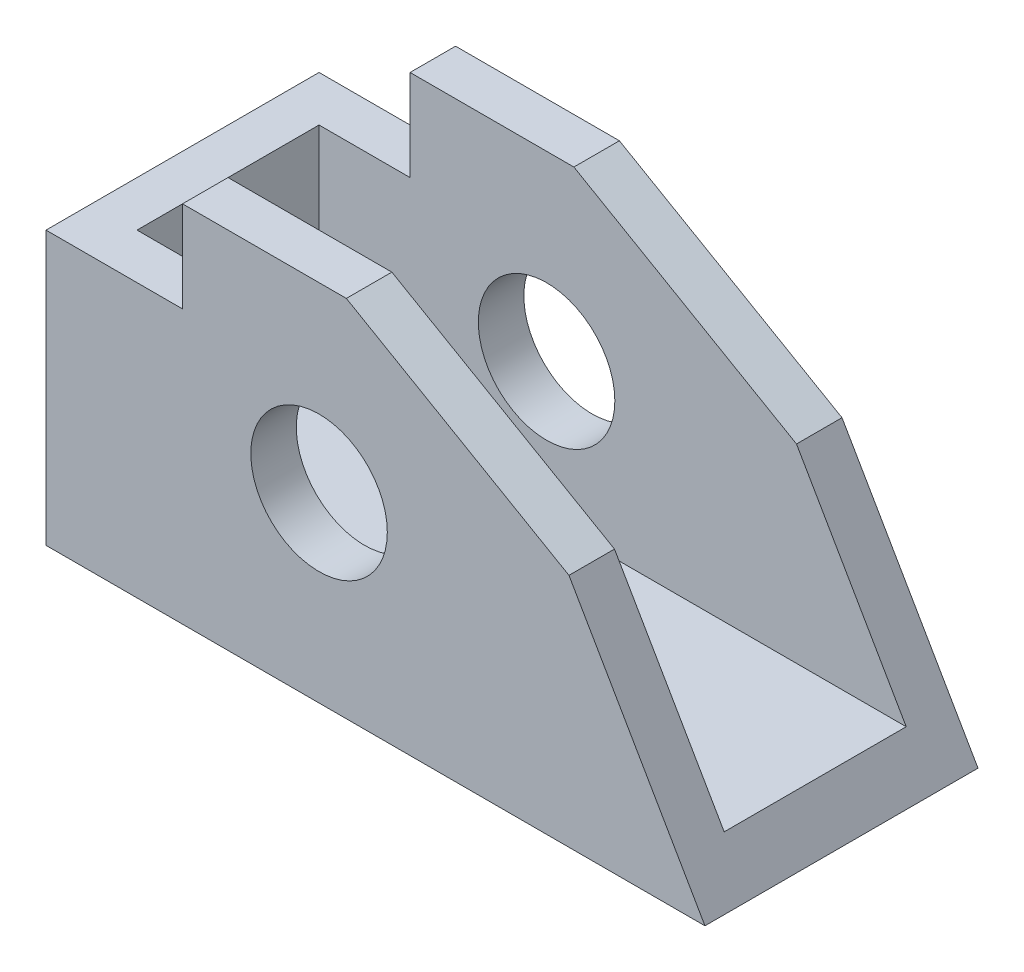
ISO-10303-21;
HEADER;
FILE_DESCRIPTION(('STEP AP214'),'2;1');
FILE_NAME('part.step','',(''),(''),'','','');
FILE_SCHEMA(('AUTOMOTIVE_DESIGN { 1 0 10303 214 1 1 1 1 }'));
ENDSEC;
DATA;
#1=APPLICATION_CONTEXT('core data for automotive mechanical design processes');
#2=APPLICATION_PROTOCOL_DEFINITION('international standard','automotive_design',2000,#1);
#3=PRODUCT_CONTEXT('',#1,'mechanical');
#4=PRODUCT('Part','Part','',(#3));
#5=PRODUCT_RELATED_PRODUCT_CATEGORY('part','',(#4));
#6=PRODUCT_DEFINITION_FORMATION('','',#4);
#7=PRODUCT_DEFINITION_CONTEXT('part definition',#1,'design');
#8=PRODUCT_DEFINITION('design','',#6,#7);
#9=PRODUCT_DEFINITION_SHAPE('','',#8);
#10=(LENGTH_UNIT() NAMED_UNIT(*) SI_UNIT(.MILLI.,.METRE.));
#11=(NAMED_UNIT(*) PLANE_ANGLE_UNIT() SI_UNIT($,.RADIAN.));
#12=(NAMED_UNIT(*) SI_UNIT($,.STERADIAN.) SOLID_ANGLE_UNIT());
#13=UNCERTAINTY_MEASURE_WITH_UNIT(LENGTH_MEASURE(1.E-05),#10,'distance_accuracy_value','');
#14=(GEOMETRIC_REPRESENTATION_CONTEXT(3) GLOBAL_UNCERTAINTY_ASSIGNED_CONTEXT((#13)) GLOBAL_UNIT_ASSIGNED_CONTEXT((#10,
#11,#12)) REPRESENTATION_CONTEXT('',''));
#15=CARTESIAN_POINT('',(0.,0.,0.));
#16=DIRECTION('',(0.,0.,1.));
#17=DIRECTION('',(1.,0.,0.));
#18=AXIS2_PLACEMENT_3D('',#15,#16,#17);
#19=CARTESIAN_POINT('',(0.,50.8,0.));
#20=DIRECTION('',(0.,1.,0.));
#21=DIRECTION('',(0.,0.,1.));
#22=AXIS2_PLACEMENT_3D('',#19,#20,#21);
#23=PLANE('',#22);
#24=DIRECTION('',(1.,0.,0.));
#25=VECTOR('',#24,1.);
#26=CARTESIAN_POINT('',(-96.8612519083969,50.8,-9.51175063613229));
#27=LINE('',#26,#25);
#28=CARTESIAN_POINT('',(-77.8112519083969,50.8,-9.51175063613229));
#29=VERTEX_POINT('',#28);
#30=CARTESIAN_POINT('',(-54.9512519083969,50.8,-9.51175063613229));
#31=VERTEX_POINT('',#30);
#32=EDGE_CURVE('E264',#29,#31,#27,.T.);
#33=ORIENTED_EDGE('',*,*,#32,.T.);
#34=DIRECTION('',(0.,0.,1.));
#35=VECTOR('',#34,1.);
#36=CARTESIAN_POINT('',(-54.9512519083969,50.8,-47.6117506361323));
#37=LINE('',#36,#35);
#38=CARTESIAN_POINT('',(-54.9512519083969,50.8,-15.8617506361323));
#39=VERTEX_POINT('',#38);
#40=EDGE_CURVE('E161',#39,#31,#37,.T.);
#41=ORIENTED_EDGE('',*,*,#40,.F.);
#42=DIRECTION('',(-1.,0.,0.));
#43=VECTOR('',#42,1.);
#44=CARTESIAN_POINT('',(0.,50.8,-15.8617506361323));
#45=LINE('',#44,#43);
#46=CARTESIAN_POINT('',(-77.8112519083969,50.8,-15.8617506361323));
#47=VERTEX_POINT('',#46);
#48=EDGE_CURVE('E194',#39,#47,#45,.T.);
#49=ORIENTED_EDGE('',*,*,#48,.T.);
#50=DIRECTION('',(0.,0.,1.));
#51=VECTOR('',#50,1.);
#52=CARTESIAN_POINT('',(-77.8112519083969,50.8,-47.6117506361323));
#53=LINE('',#52,#51);
#54=EDGE_CURVE('E248',#47,#29,#53,.T.);
#55=ORIENTED_EDGE('',*,*,#54,.T.);
#56=EDGE_LOOP('',(#33,#41,#49,#55));
#57=FACE_BOUND('',#56,.T.);
#58=ADVANCED_FACE('F39',(#57),#23,.T.);
#59=CARTESIAN_POINT('',(-96.8612519083969,50.8,-9.51175063613229));
#60=DIRECTION('',(0.,0.,-1.));
#61=DIRECTION('',(-1.,0.,0.));
#62=AXIS2_PLACEMENT_3D('',#59,#60,#61);
#63=PLANE('',#62);
#64=CARTESIAN_POINT('',(-58.7612519083969,25.4,-9.51175063613229));
#65=DIRECTION('',(0.,0.,1.));
#66=DIRECTION('',(1.,0.,0.));
#67=AXIS2_PLACEMENT_3D('',#64,#65,#66);
#68=CIRCLE('',#67,9.525);
#69=CARTESIAN_POINT('',(-49.2362519083969,25.4,-9.51175063613229));
#70=VERTEX_POINT('',#69);
#71=EDGE_CURVE('E247',#70,#70,#68,.T.);
#72=ORIENTED_EDGE('',*,*,#71,.F.);
#73=EDGE_LOOP('',(#72));
#74=FACE_BOUND('',#73,.T.);
#75=DIRECTION('',(-0.866025403784442,0.499999999999995,0.));
#76=VECTOR('',#75,1.);
#77=CARTESIAN_POINT('',(8.25923227902564,14.3054099387855,-9.51175063613229));
#78=LINE('',#77,#76);
#79=CARTESIAN_POINT('',(-23.8883424206465,32.8658208454345,-9.51175063613229));
#80=VERTEX_POINT('',#79);
#81=EDGE_CURVE('E172',#80,#31,#78,.T.);
#82=ORIENTED_EDGE('',*,*,#81,.T.);
#83=ORIENTED_EDGE('',*,*,#32,.F.);
#84=DIRECTION('',(0.,1.,0.));
#85=VECTOR('',#84,1.);
#86=CARTESIAN_POINT('',(-77.8112519083969,38.1,-9.51175063613229));
#87=LINE('',#86,#85);
#88=CARTESIAN_POINT('',(-77.8112519083969,38.1,-9.51175063613229));
#89=VERTEX_POINT('',#88);
#90=EDGE_CURVE('E233',#89,#29,#87,.T.);
#91=ORIENTED_EDGE('',*,*,#90,.F.);
#92=DIRECTION('',(1.,0.,0.));
#93=VECTOR('',#92,1.);
#94=CARTESIAN_POINT('',(-96.8612519083969,38.1,-9.51175063613229));
#95=LINE('',#94,#93);
#96=CARTESIAN_POINT('',(-96.8612519083969,38.1,-9.51175063613229));
#97=VERTEX_POINT('',#96);
#98=EDGE_CURVE('E227',#97,#89,#95,.T.);
#99=ORIENTED_EDGE('',*,*,#98,.F.);
#100=DIRECTION('',(0.,-1.,0.));
#101=VECTOR('',#100,1.);
#102=CARTESIAN_POINT('',(-96.8612519083969,50.8,-9.51175063613229));
#103=LINE('',#102,#101);
#104=CARTESIAN_POINT('',(-96.8612519083969,0.,-9.51175063613229));
#105=VERTEX_POINT('',#104);
#106=EDGE_CURVE('E285',#97,#105,#103,.T.);
#107=ORIENTED_EDGE('',*,*,#106,.T.);
#108=DIRECTION('',(1.,0.,0.));
#109=VECTOR('',#108,1.);
#110=CARTESIAN_POINT('',(-96.8612519083969,0.,-9.51175063613229));
#111=LINE('',#110,#109);
#112=CARTESIAN_POINT('',(-4.91325190839691,0.,-9.51175063613229));
#113=VERTEX_POINT('',#112);
#114=EDGE_CURVE('E275',#105,#113,#111,.T.);
#115=ORIENTED_EDGE('',*,*,#114,.T.);
#116=DIRECTION('',(-0.499999999999998,0.86602540378444,0.));
#117=VECTOR('',#116,1.);
#118=CARTESIAN_POINT('',(-3.6849389312977,-2.12750048393205,-9.51175063613229));
#119=LINE('',#118,#117);
#120=EDGE_CURVE('E168',#113,#80,#119,.T.);
#121=ORIENTED_EDGE('',*,*,#120,.T.);
#122=EDGE_LOOP('',(#82,#83,#91,#99,#107,#115,#121));
#123=FACE_BOUND('',#122,.T.);
#124=ADVANCED_FACE('F329',(#74,#123),#63,.F.);
#125=CARTESIAN_POINT('',(-96.8612519083969,50.8,-47.6117506361323));
#126=DIRECTION('',(0.,0.,1.));
#127=DIRECTION('',(1.,0.,0.));
#128=AXIS2_PLACEMENT_3D('',#125,#126,#127);
#129=PLANE('',#128);
#130=CARTESIAN_POINT('',(-58.7612519083969,25.4,-47.6117506361323));
#131=DIRECTION('',(0.,0.,1.));
#132=DIRECTION('',(1.,0.,0.));
#133=AXIS2_PLACEMENT_3D('',#130,#131,#132);
#134=CIRCLE('',#133,9.525);
#135=CARTESIAN_POINT('',(-49.2362519083969,25.4,-47.6117506361323));
#136=VERTEX_POINT('',#135);
#137=EDGE_CURVE('E256',#136,#136,#134,.T.);
#138=ORIENTED_EDGE('',*,*,#137,.T.);
#139=EDGE_LOOP('',(#138));
#140=FACE_BOUND('',#139,.T.);
#141=DIRECTION('',(-0.866025403784442,0.499999999999995,0.));
#142=VECTOR('',#141,1.);
#143=CARTESIAN_POINT('',(8.25923227902564,14.3054099387855,-47.6117506361323));
#144=LINE('',#143,#142);
#145=CARTESIAN_POINT('',(-23.8883424206465,32.8658208454345,-47.6117506361323));
#146=VERTEX_POINT('',#145);
#147=CARTESIAN_POINT('',(-54.9512519083969,50.8,-47.6117506361323));
#148=VERTEX_POINT('',#147);
#149=EDGE_CURVE('E153',#146,#148,#144,.T.);
#150=ORIENTED_EDGE('',*,*,#149,.F.);
#151=DIRECTION('',(-0.499999999999998,0.86602540378444,0.));
#152=VECTOR('',#151,1.);
#153=CARTESIAN_POINT('',(-3.6849389312977,-2.12750048393205,-47.6117506361323));
#154=LINE('',#153,#152);
#155=CARTESIAN_POINT('',(-4.91325190839691,0.,-47.6117506361323));
#156=VERTEX_POINT('',#155);
#157=EDGE_CURVE('E141',#156,#146,#154,.T.);
#158=ORIENTED_EDGE('',*,*,#157,.F.);
#159=DIRECTION('',(-1.,0.,0.));
#160=VECTOR('',#159,1.);
#161=CARTESIAN_POINT('',(-96.8612519083969,0.,-47.6117506361323));
#162=LINE('',#161,#160);
#163=CARTESIAN_POINT('',(-96.8612519083969,0.,-47.6117506361323));
#164=VERTEX_POINT('',#163);
#165=EDGE_CURVE('E268',#156,#164,#162,.T.);
#166=ORIENTED_EDGE('',*,*,#165,.T.);
#167=DIRECTION('',(0.,-1.,0.));
#168=VECTOR('',#167,1.);
#169=CARTESIAN_POINT('',(-96.8612519083969,50.8,-47.6117506361323));
#170=LINE('',#169,#168);
#171=CARTESIAN_POINT('',(-96.8612519083969,38.1,-47.6117506361323));
#172=VERTEX_POINT('',#171);
#173=EDGE_CURVE('E271',#172,#164,#170,.T.);
#174=ORIENTED_EDGE('',*,*,#173,.F.);
#175=DIRECTION('',(1.,0.,0.));
#176=VECTOR('',#175,1.);
#177=CARTESIAN_POINT('',(-96.8612519083969,38.1,-47.6117506361323));
#178=LINE('',#177,#176);
#179=CARTESIAN_POINT('',(-77.8112519083969,38.1,-47.6117506361323));
#180=VERTEX_POINT('',#179);
#181=EDGE_CURVE('E228',#172,#180,#178,.T.);
#182=ORIENTED_EDGE('',*,*,#181,.T.);
#183=DIRECTION('',(0.,1.,0.));
#184=VECTOR('',#183,1.);
#185=CARTESIAN_POINT('',(-77.8112519083969,38.1,-47.6117506361323));
#186=LINE('',#185,#184);
#187=CARTESIAN_POINT('',(-77.8112519083969,50.8,-47.6117506361323));
#188=VERTEX_POINT('',#187);
#189=EDGE_CURVE('E232',#180,#188,#186,.T.);
#190=ORIENTED_EDGE('',*,*,#189,.T.);
#191=DIRECTION('',(-1.,0.,0.));
#192=VECTOR('',#191,1.);
#193=CARTESIAN_POINT('',(-96.8612519083969,50.8,-47.6117506361323));
#194=LINE('',#193,#192);
#195=EDGE_CURVE('E166',#148,#188,#194,.T.);
#196=ORIENTED_EDGE('',*,*,#195,.F.);
#197=EDGE_LOOP('',(#150,#158,#166,#174,#182,#190,#196));
#198=FACE_BOUND('',#197,.T.);
#199=ADVANCED_FACE('F164',(#140,#198),#129,.F.);
#200=DIRECTION('',(-1.,0.,0.));
#201=VECTOR('',#200,1.);
#202=CARTESIAN_POINT('',(0.,50.8,-41.2617506361323));
#203=LINE('',#202,#201);
#204=CARTESIAN_POINT('',(-54.9512519083969,50.8,-41.2617506361323));
#205=VERTEX_POINT('',#204);
#206=CARTESIAN_POINT('',(-77.8112519083969,50.8,-41.2617506361323));
#207=VERTEX_POINT('',#206);
#208=EDGE_CURVE('E189',#205,#207,#203,.T.);
#209=ORIENTED_EDGE('',*,*,#208,.F.);
#210=EDGE_CURVE('E178',#148,#205,#37,.T.);
#211=ORIENTED_EDGE('',*,*,#210,.F.);
#212=ORIENTED_EDGE('',*,*,#195,.T.);
#213=EDGE_CURVE('E243',#188,#207,#53,.T.);
#214=ORIENTED_EDGE('',*,*,#213,.T.);
#215=EDGE_LOOP('',(#209,#211,#212,#214));
#216=FACE_BOUND('',#215,.T.);
#217=ADVANCED_FACE('F343',(#216),#23,.T.);
#218=CARTESIAN_POINT('',(0.,6.35,-41.2617506361323));
#219=DIRECTION('',(0.,0.,-1.));
#220=DIRECTION('',(-1.,0.,0.));
#221=AXIS2_PLACEMENT_3D('',#218,#219,#220);
#222=PLANE('',#221);
#223=CARTESIAN_POINT('',(-58.7612519083969,25.4,-41.2617506361323));
#224=DIRECTION('',(0.,0.,-1.));
#225=DIRECTION('',(-1.,0.,0.));
#226=AXIS2_PLACEMENT_3D('',#223,#224,#225);
#227=CIRCLE('',#226,9.525);
#228=CARTESIAN_POINT('',(-49.2362519083969,25.4,-41.2617506361323));
#229=VERTEX_POINT('',#228);
#230=EDGE_CURVE('E223',#229,#229,#227,.F.);
#231=ORIENTED_EDGE('',*,*,#230,.F.);
#232=EDGE_LOOP('',(#231));
#233=FACE_BOUND('',#232,.T.);
#234=DIRECTION('',(0.866025403784442,-0.499999999999995,0.));
#235=VECTOR('',#234,1.);
#236=CARTESIAN_POINT('',(5.50960162201007,15.8929099387855,-41.2617506361323));
#237=LINE('',#236,#235);
#238=CARTESIAN_POINT('',(-23.8883424206465,32.8658208454345,-41.2617506361323));
#239=VERTEX_POINT('',#238);
#240=EDGE_CURVE('E159',#205,#239,#237,.T.);
#241=ORIENTED_EDGE('',*,*,#240,.F.);
#242=ORIENTED_EDGE('',*,*,#208,.T.);
#243=DIRECTION('',(0.,1.,0.));
#244=VECTOR('',#243,1.);
#245=CARTESIAN_POINT('',(-77.8112519083969,38.1,-41.2617506361323));
#246=LINE('',#245,#244);
#247=CARTESIAN_POINT('',(-77.8112519083969,38.1,-41.2617506361323));
#248=VERTEX_POINT('',#247);
#249=EDGE_CURVE('E219',#248,#207,#246,.T.);
#250=ORIENTED_EDGE('',*,*,#249,.F.);
#251=DIRECTION('',(1.,0.,0.));
#252=VECTOR('',#251,1.);
#253=CARTESIAN_POINT('',(-96.8612519083969,38.1,-41.2617506361323));
#254=LINE('',#253,#252);
#255=CARTESIAN_POINT('',(-90.5112519083969,38.1,-41.2617506361323));
#256=VERTEX_POINT('',#255);
#257=EDGE_CURVE('E295',#256,#248,#254,.T.);
#258=ORIENTED_EDGE('',*,*,#257,.F.);
#259=DIRECTION('',(0.,1.,0.));
#260=VECTOR('',#259,1.);
#261=CARTESIAN_POINT('',(-90.5112519083969,6.35,-41.2617506361323));
#262=LINE('',#261,#260);
#263=CARTESIAN_POINT('',(-90.5112519083969,6.35,-41.2617506361323));
#264=VERTEX_POINT('',#263);
#265=EDGE_CURVE('E63',#264,#256,#262,.T.);
#266=ORIENTED_EDGE('',*,*,#265,.F.);
#267=DIRECTION('',(-1.,0.,0.));
#268=VECTOR('',#267,1.);
#269=CARTESIAN_POINT('',(0.,6.35,-41.2617506361323));
#270=LINE('',#269,#268);
#271=CARTESIAN_POINT('',(-8.57942611775102,6.35,-41.2617506361323));
#272=VERTEX_POINT('',#271);
#273=EDGE_CURVE('E190',#272,#264,#270,.T.);
#274=ORIENTED_EDGE('',*,*,#273,.F.);
#275=DIRECTION('',(0.499999999999998,-0.86602540378444,0.));
#276=VECTOR('',#275,1.);
#277=CARTESIAN_POINT('',(-6.43456958831328,2.63499951606797,-41.2617506361323));
#278=LINE('',#277,#276);
#279=EDGE_CURVE('E55',#239,#272,#278,.T.);
#280=ORIENTED_EDGE('',*,*,#279,.F.);
#281=EDGE_LOOP('',(#241,#242,#250,#258,#266,#274,#280));
#282=FACE_BOUND('',#281,.T.);
#283=ADVANCED_FACE('F304',(#233,#282),#222,.F.);
#284=CARTESIAN_POINT('',(0.,6.35,-15.8617506361323));
#285=DIRECTION('',(0.,0.,-1.));
#286=DIRECTION('',(-1.,0.,0.));
#287=AXIS2_PLACEMENT_3D('',#284,#285,#286);
#288=PLANE('',#287);
#289=CARTESIAN_POINT('',(-58.7612519083969,25.4,-15.8617506361323));
#290=DIRECTION('',(0.,0.,-1.));
#291=DIRECTION('',(-1.,0.,0.));
#292=AXIS2_PLACEMENT_3D('',#289,#290,#291);
#293=CIRCLE('',#292,9.525);
#294=CARTESIAN_POINT('',(-49.2362519083969,25.4,-15.8617506361323));
#295=VERTEX_POINT('',#294);
#296=EDGE_CURVE('E215',#295,#295,#293,.F.);
#297=ORIENTED_EDGE('',*,*,#296,.T.);
#298=EDGE_LOOP('',(#297));
#299=FACE_BOUND('',#298,.T.);
#300=ORIENTED_EDGE('',*,*,#48,.F.);
#301=DIRECTION('',(0.866025403784442,-0.499999999999995,0.));
#302=VECTOR('',#301,1.);
#303=CARTESIAN_POINT('',(5.50960162201007,15.8929099387855,-15.8617506361323));
#304=LINE('',#303,#302);
#305=CARTESIAN_POINT('',(-23.8883424206465,32.8658208454345,-15.8617506361323));
#306=VERTEX_POINT('',#305);
#307=EDGE_CURVE('E11',#39,#306,#304,.T.);
#308=ORIENTED_EDGE('',*,*,#307,.T.);
#309=DIRECTION('',(0.499999999999998,-0.86602540378444,0.));
#310=VECTOR('',#309,1.);
#311=CARTESIAN_POINT('',(-6.43456958831328,2.63499951606797,-15.8617506361323));
#312=LINE('',#311,#310);
#313=CARTESIAN_POINT('',(-8.57942611775102,6.35,-15.8617506361323));
#314=VERTEX_POINT('',#313);
#315=EDGE_CURVE('E180',#306,#314,#312,.T.);
#316=ORIENTED_EDGE('',*,*,#315,.T.);
#317=DIRECTION('',(-1.,0.,0.));
#318=VECTOR('',#317,1.);
#319=CARTESIAN_POINT('',(0.,6.35,-15.8617506361323));
#320=LINE('',#319,#318);
#321=CARTESIAN_POINT('',(-90.5112519083969,6.35,-15.8617506361323));
#322=VERTEX_POINT('',#321);
#323=EDGE_CURVE('E198',#314,#322,#320,.T.);
#324=ORIENTED_EDGE('',*,*,#323,.T.);
#325=DIRECTION('',(0.,1.,0.));
#326=VECTOR('',#325,1.);
#327=CARTESIAN_POINT('',(-90.5112519083969,6.35,-15.8617506361323));
#328=LINE('',#327,#326);
#329=CARTESIAN_POINT('',(-90.5112519083969,38.1,-15.8617506361323));
#330=VERTEX_POINT('',#329);
#331=EDGE_CURVE('E205',#322,#330,#328,.T.);
#332=ORIENTED_EDGE('',*,*,#331,.T.);
#333=DIRECTION('',(1.,0.,0.));
#334=VECTOR('',#333,1.);
#335=CARTESIAN_POINT('',(-96.8612519083969,38.1,-15.8617506361323));
#336=LINE('',#335,#334);
#337=CARTESIAN_POINT('',(-77.8112519083969,38.1,-15.8617506361323));
#338=VERTEX_POINT('',#337);
#339=EDGE_CURVE('E292',#330,#338,#336,.T.);
#340=ORIENTED_EDGE('',*,*,#339,.T.);
#341=DIRECTION('',(0.,1.,0.));
#342=VECTOR('',#341,1.);
#343=CARTESIAN_POINT('',(-77.8112519083969,38.1,-15.8617506361323));
#344=LINE('',#343,#342);
#345=EDGE_CURVE('E209',#338,#47,#344,.T.);
#346=ORIENTED_EDGE('',*,*,#345,.T.);
#347=EDGE_LOOP('',(#300,#308,#316,#324,#332,#340,#346));
#348=FACE_BOUND('',#347,.T.);
#349=ADVANCED_FACE('F310',(#299,#348),#288,.T.);
#350=CARTESIAN_POINT('',(0.,6.35,0.));
#351=DIRECTION('',(0.,1.,0.));
#352=DIRECTION('',(0.,0.,1.));
#353=AXIS2_PLACEMENT_3D('',#350,#351,#352);
#354=PLANE('',#353);
#355=ORIENTED_EDGE('',*,*,#323,.F.);
#356=DIRECTION('',(0.,0.,-1.));
#357=VECTOR('',#356,1.);
#358=CARTESIAN_POINT('',(-8.57942611775102,6.35,0.));
#359=LINE('',#358,#357);
#360=EDGE_CURVE('E48',#314,#272,#359,.T.);
#361=ORIENTED_EDGE('',*,*,#360,.T.);
#362=ORIENTED_EDGE('',*,*,#273,.T.);
#363=DIRECTION('',(0.,0.,1.));
#364=VECTOR('',#363,1.);
#365=CARTESIAN_POINT('',(-90.5112519083969,6.35,0.));
#366=LINE('',#365,#364);
#367=EDGE_CURVE('E193',#264,#322,#366,.T.);
#368=ORIENTED_EDGE('',*,*,#367,.T.);
#369=EDGE_LOOP('',(#355,#361,#362,#368));
#370=FACE_BOUND('',#369,.T.);
#371=ADVANCED_FACE('F302',(#370),#354,.T.);
#372=CARTESIAN_POINT('',(-58.7612519083969,25.4,-47.6117506361323));
#373=DIRECTION('',(0.,0.,1.));
#374=DIRECTION('',(1.,0.,0.));
#375=AXIS2_PLACEMENT_3D('',#372,#373,#374);
#376=CYLINDRICAL_SURFACE('',#375,9.525);
#377=CARTESIAN_POINT('',(-49.2362519083969,25.4,-9.51175063613229));
#378=CARTESIAN_POINT('',(-49.2362519083969,25.4,-9.57789646946563));
#379=CARTESIAN_POINT('',(-49.2362519083969,25.4,-9.64404230279896));
#380=CARTESIAN_POINT('',(-49.2362519083969,25.4,-9.77633396946563));
#381=CARTESIAN_POINT('',(-49.2362519083969,25.4,-9.84247980279896));
#382=CARTESIAN_POINT('',(-49.2362519083969,25.4,-9.97477146946562));
#383=CARTESIAN_POINT('',(-49.2362519083969,25.4,-10.040917302799));
#384=CARTESIAN_POINT('',(-49.2362519083969,25.4,-10.1732089694656));
#385=CARTESIAN_POINT('',(-49.2362519083969,25.4,-10.239354802799));
#386=CARTESIAN_POINT('',(-49.2362519083969,25.4,-10.3716464694656));
#387=CARTESIAN_POINT('',(-49.2362519083969,25.4,-10.437792302799));
#388=CARTESIAN_POINT('',(-49.2362519083969,25.4,-10.5700839694656));
#389=CARTESIAN_POINT('',(-49.2362519083969,25.4,-10.636229802799));
#390=CARTESIAN_POINT('',(-49.2362519083969,25.4,-10.7685214694656));
#391=CARTESIAN_POINT('',(-49.2362519083969,25.4,-10.834667302799));
#392=CARTESIAN_POINT('',(-49.2362519083969,25.4,-10.9669589694656));
#393=CARTESIAN_POINT('',(-49.2362519083969,25.4,-11.033104802799));
#394=CARTESIAN_POINT('',(-49.2362519083969,25.4,-11.1653964694656));
#395=CARTESIAN_POINT('',(-49.2362519083969,25.4,-11.231542302799));
#396=CARTESIAN_POINT('',(-49.2362519083969,25.4,-11.3638339694656));
#397=CARTESIAN_POINT('',(-49.2362519083969,25.4,-11.429979802799));
#398=CARTESIAN_POINT('',(-49.2362519083969,25.4,-11.5622714694656));
#399=CARTESIAN_POINT('',(-49.2362519083969,25.4,-11.628417302799));
#400=CARTESIAN_POINT('',(-49.2362519083969,25.4,-11.7607089694656));
#401=CARTESIAN_POINT('',(-49.2362519083969,25.4,-11.826854802799));
#402=CARTESIAN_POINT('',(-49.2362519083969,25.4,-11.9591464694656));
#403=CARTESIAN_POINT('',(-49.2362519083969,25.4,-12.025292302799));
#404=CARTESIAN_POINT('',(-49.2362519083969,25.4,-12.1575839694656));
#405=CARTESIAN_POINT('',(-49.2362519083969,25.4,-12.223729802799));
#406=CARTESIAN_POINT('',(-49.2362519083969,25.4,-12.3560214694656));
#407=CARTESIAN_POINT('',(-49.2362519083969,25.4,-12.422167302799));
#408=CARTESIAN_POINT('',(-49.2362519083969,25.4,-12.5544589694656));
#409=CARTESIAN_POINT('',(-49.2362519083969,25.4,-12.620604802799));
#410=CARTESIAN_POINT('',(-49.2362519083969,25.4,-12.7528964694656));
#411=CARTESIAN_POINT('',(-49.2362519083969,25.4,-12.819042302799));
#412=CARTESIAN_POINT('',(-49.2362519083969,25.4,-12.9513339694656));
#413=CARTESIAN_POINT('',(-49.2362519083969,25.4,-13.017479802799));
#414=CARTESIAN_POINT('',(-49.2362519083969,25.4,-13.1497714694656));
#415=CARTESIAN_POINT('',(-49.2362519083969,25.4,-13.215917302799));
#416=CARTESIAN_POINT('',(-49.2362519083969,25.4,-13.3482089694656));
#417=CARTESIAN_POINT('',(-49.2362519083969,25.4,-13.414354802799));
#418=CARTESIAN_POINT('',(-49.2362519083969,25.4,-13.5466464694656));
#419=CARTESIAN_POINT('',(-49.2362519083969,25.4,-13.612792302799));
#420=CARTESIAN_POINT('',(-49.2362519083969,25.4,-13.7450839694656));
#421=CARTESIAN_POINT('',(-49.2362519083969,25.4,-13.811229802799));
#422=CARTESIAN_POINT('',(-49.2362519083969,25.4,-13.9435214694656));
#423=CARTESIAN_POINT('',(-49.2362519083969,25.4,-14.009667302799));
#424=CARTESIAN_POINT('',(-49.2362519083969,25.4,-14.1419589694656));
#425=CARTESIAN_POINT('',(-49.2362519083969,25.4,-14.208104802799));
#426=CARTESIAN_POINT('',(-49.2362519083969,25.4,-14.3403964694656));
#427=CARTESIAN_POINT('',(-49.2362519083969,25.4,-14.406542302799));
#428=CARTESIAN_POINT('',(-49.2362519083969,25.4,-14.5388339694656));
#429=CARTESIAN_POINT('',(-49.2362519083969,25.4,-14.604979802799));
#430=CARTESIAN_POINT('',(-49.2362519083969,25.4,-14.7372714694656));
#431=CARTESIAN_POINT('',(-49.2362519083969,25.4,-14.803417302799));
#432=CARTESIAN_POINT('',(-49.2362519083969,25.4,-14.9357089694656));
#433=CARTESIAN_POINT('',(-49.2362519083969,25.4,-15.001854802799));
#434=CARTESIAN_POINT('',(-49.2362519083969,25.4,-15.1341464694656));
#435=CARTESIAN_POINT('',(-49.2362519083969,25.4,-15.200292302799));
#436=CARTESIAN_POINT('',(-49.2362519083969,25.4,-15.3325839694656));
#437=CARTESIAN_POINT('',(-49.2362519083969,25.4,-15.398729802799));
#438=CARTESIAN_POINT('',(-49.2362519083969,25.4,-15.5310214694656));
#439=CARTESIAN_POINT('',(-49.2362519083969,25.4,-15.597167302799));
#440=CARTESIAN_POINT('',(-49.2362519083969,25.4,-15.7294589694656));
#441=CARTESIAN_POINT('',(-49.2362519083969,25.4,-15.795604802799));
#442=CARTESIAN_POINT('',(-49.2362519083969,25.4,-15.8617506361323));
#443=B_SPLINE_CURVE_WITH_KNOTS('',3,(#377,#378,#379,#380,#381,#382,#383,#384,#385,#386,#387,
#388,#389,#390,#391,#392,#393,#394,#395,#396,#397,#398,#399,#400,#401,#402,#403,#404,#405,#406,
#407,#408,#409,#410,#411,#412,#413,#414,#415,#416,#417,#418,#419,#420,#421,#422,#423,#424,#425,
#426,#427,#428,#429,#430,#431,#432,#433,#434,#435,#436,#437,#438,#439,#440,#441,#442),
.UNSPECIFIED.,.F.,.F.,(4,2,2,2,2,2,2,2,2,2,2,2,2,2,2,2,2,2,2,2,2,2,2,2,2,2,2,2,2,2,2,2,4),(0.,
0.198437500000002,0.396874999999998,0.5953125,0.793749999999996,0.992187499999998,1.190625,
1.3890625,1.5875,1.7859375,1.984375,2.1828125,2.38125,2.5796875,2.778125,2.97656249999999,3.175,
3.3734375,3.571875,3.7703125,3.96874999999999,4.1671875,4.365625,4.56406249999999,4.7625,
4.9609375,5.15937499999999,5.3578125,5.55625,5.75468749999999,5.953125,6.15156249999999,
6.34999999999999),.UNSPECIFIED.);
#444=EDGE_CURVE('BSEAM374',#70,#295,#443,.T.);
#445=ORIENTED_EDGE('',*,*,#71,.T.);
#446=ORIENTED_EDGE('',*,*,#296,.F.);
#447=ORIENTED_EDGE('',*,*,#444,.T.);
#448=ORIENTED_EDGE('',*,*,#444,.F.);
#449=EDGE_LOOP('',(#445,#447,#446,#448));
#450=FACE_BOUND('',#449,.T.);
#451=ADVANCED_FACE('F374',(#450),#376,.F.);
#452=CARTESIAN_POINT('',(-77.8112519083969,38.1,-47.6117506361323));
#453=DIRECTION('',(1.,0.,0.));
#454=DIRECTION('',(0.,0.,-1.));
#455=AXIS2_PLACEMENT_3D('',#452,#453,#454);
#456=PLANE('',#455);
#457=ORIENTED_EDGE('',*,*,#345,.F.);
#458=DIRECTION('',(0.,0.,1.));
#459=VECTOR('',#458,1.);
#460=CARTESIAN_POINT('',(-77.8112519083969,38.1,-47.6117506361323));
#461=LINE('',#460,#459);
#462=EDGE_CURVE('E253',#338,#89,#461,.T.);
#463=ORIENTED_EDGE('',*,*,#462,.T.);
#464=ORIENTED_EDGE('',*,*,#90,.T.);
#465=ORIENTED_EDGE('',*,*,#54,.F.);
#466=EDGE_LOOP('',(#457,#463,#464,#465));
#467=FACE_BOUND('',#466,.T.);
#468=ADVANCED_FACE('F339',(#467),#456,.F.);
#469=CARTESIAN_POINT('',(-96.8612519083969,50.8,-47.6117506361323));
#470=DIRECTION('',(1.,0.,0.));
#471=DIRECTION('',(0.,0.,-1.));
#472=AXIS2_PLACEMENT_3D('',#469,#470,#471);
#473=PLANE('',#472);
#474=ORIENTED_EDGE('',*,*,#106,.F.);
#475=DIRECTION('',(0.,0.,1.));
#476=VECTOR('',#475,1.);
#477=CARTESIAN_POINT('',(-96.8612519083969,38.1,-47.6117506361323));
#478=LINE('',#477,#476);
#479=EDGE_CURVE('E236',#172,#97,#478,.T.);
#480=ORIENTED_EDGE('',*,*,#479,.F.);
#481=ORIENTED_EDGE('',*,*,#173,.T.);
#482=DIRECTION('',(0.,0.,1.));
#483=VECTOR('',#482,1.);
#484=CARTESIAN_POINT('',(-96.8612519083969,0.,-47.6117506361323));
#485=LINE('',#484,#483);
#486=EDGE_CURVE('E260',#164,#105,#485,.T.);
#487=ORIENTED_EDGE('',*,*,#486,.T.);
#488=EDGE_LOOP('',(#474,#480,#481,#487));
#489=FACE_BOUND('',#488,.T.);
#490=ADVANCED_FACE('F41',(#489),#473,.F.);
#491=CARTESIAN_POINT('',(0.,0.,0.));
#492=DIRECTION('',(0.,1.,0.));
#493=DIRECTION('',(0.,0.,1.));
#494=AXIS2_PLACEMENT_3D('',#491,#492,#493);
#495=PLANE('',#494);
#496=ORIENTED_EDGE('',*,*,#486,.F.);
#497=ORIENTED_EDGE('',*,*,#165,.F.);
#498=DIRECTION('',(0.,0.,-1.));
#499=VECTOR('',#498,1.);
#500=CARTESIAN_POINT('',(-4.91325190839692,0.,-47.6117506361323));
#501=LINE('',#500,#499);
#502=EDGE_CURVE('E146',#113,#156,#501,.T.);
#503=ORIENTED_EDGE('',*,*,#502,.F.);
#504=ORIENTED_EDGE('',*,*,#114,.F.);
#505=EDGE_LOOP('',(#496,#497,#503,#504));
#506=FACE_BOUND('',#505,.T.);
#507=ADVANCED_FACE('F334',(#506),#495,.F.);
#508=CARTESIAN_POINT('',(-49.2362519083969,25.4,-41.2617506361323));
#509=CARTESIAN_POINT('',(-49.2362519083969,25.4,-41.3278964694656));
#510=CARTESIAN_POINT('',(-49.2362519083969,25.4,-41.394042302799));
#511=CARTESIAN_POINT('',(-49.2362519083969,25.4,-41.5263339694656));
#512=CARTESIAN_POINT('',(-49.2362519083969,25.4,-41.592479802799));
#513=CARTESIAN_POINT('',(-49.2362519083969,25.4,-41.7247714694656));
#514=CARTESIAN_POINT('',(-49.2362519083969,25.4,-41.790917302799));
#515=CARTESIAN_POINT('',(-49.2362519083969,25.4,-41.9232089694656));
#516=CARTESIAN_POINT('',(-49.2362519083969,25.4,-41.989354802799));
#517=CARTESIAN_POINT('',(-49.2362519083969,25.4,-42.1216464694656));
#518=CARTESIAN_POINT('',(-49.2362519083969,25.4,-42.187792302799));
#519=CARTESIAN_POINT('',(-49.2362519083969,25.4,-42.3200839694656));
#520=CARTESIAN_POINT('',(-49.2362519083969,25.4,-42.386229802799));
#521=CARTESIAN_POINT('',(-49.2362519083969,25.4,-42.5185214694656));
#522=CARTESIAN_POINT('',(-49.2362519083969,25.4,-42.584667302799));
#523=CARTESIAN_POINT('',(-49.2362519083969,25.4,-42.7169589694656));
#524=CARTESIAN_POINT('',(-49.2362519083969,25.4,-42.783104802799));
#525=CARTESIAN_POINT('',(-49.2362519083969,25.4,-42.9153964694656));
#526=CARTESIAN_POINT('',(-49.2362519083969,25.4,-42.981542302799));
#527=CARTESIAN_POINT('',(-49.2362519083969,25.4,-43.1138339694656));
#528=CARTESIAN_POINT('',(-49.2362519083969,25.4,-43.179979802799));
#529=CARTESIAN_POINT('',(-49.2362519083969,25.4,-43.3122714694656));
#530=CARTESIAN_POINT('',(-49.2362519083969,25.4,-43.378417302799));
#531=CARTESIAN_POINT('',(-49.2362519083969,25.4,-43.5107089694656));
#532=CARTESIAN_POINT('',(-49.2362519083969,25.4,-43.576854802799));
#533=CARTESIAN_POINT('',(-49.2362519083969,25.4,-43.7091464694656));
#534=CARTESIAN_POINT('',(-49.2362519083969,25.4,-43.775292302799));
#535=CARTESIAN_POINT('',(-49.2362519083969,25.4,-43.9075839694656));
#536=CARTESIAN_POINT('',(-49.2362519083969,25.4,-43.973729802799));
#537=CARTESIAN_POINT('',(-49.2362519083969,25.4,-44.1060214694656));
#538=CARTESIAN_POINT('',(-49.2362519083969,25.4,-44.172167302799));
#539=CARTESIAN_POINT('',(-49.2362519083969,25.4,-44.3044589694656));
#540=CARTESIAN_POINT('',(-49.2362519083969,25.4,-44.370604802799));
#541=CARTESIAN_POINT('',(-49.2362519083969,25.4,-44.5028964694656));
#542=CARTESIAN_POINT('',(-49.2362519083969,25.4,-44.569042302799));
#543=CARTESIAN_POINT('',(-49.2362519083969,25.4,-44.7013339694656));
#544=CARTESIAN_POINT('',(-49.2362519083969,25.4,-44.767479802799));
#545=CARTESIAN_POINT('',(-49.2362519083969,25.4,-44.8997714694656));
#546=CARTESIAN_POINT('',(-49.2362519083969,25.4,-44.965917302799));
#547=CARTESIAN_POINT('',(-49.2362519083969,25.4,-45.0982089694656));
#548=CARTESIAN_POINT('',(-49.2362519083969,25.4,-45.164354802799));
#549=CARTESIAN_POINT('',(-49.2362519083969,25.4,-45.2966464694656));
#550=CARTESIAN_POINT('',(-49.2362519083969,25.4,-45.362792302799));
#551=CARTESIAN_POINT('',(-49.2362519083969,25.4,-45.4950839694656));
#552=CARTESIAN_POINT('',(-49.2362519083969,25.4,-45.561229802799));
#553=CARTESIAN_POINT('',(-49.2362519083969,25.4,-45.6935214694656));
#554=CARTESIAN_POINT('',(-49.2362519083969,25.4,-45.759667302799));
#555=CARTESIAN_POINT('',(-49.2362519083969,25.4,-45.8919589694656));
#556=CARTESIAN_POINT('',(-49.2362519083969,25.4,-45.958104802799));
#557=CARTESIAN_POINT('',(-49.2362519083969,25.4,-46.0903964694656));
#558=CARTESIAN_POINT('',(-49.2362519083969,25.4,-46.156542302799));
#559=CARTESIAN_POINT('',(-49.2362519083969,25.4,-46.2888339694656));
#560=CARTESIAN_POINT('',(-49.2362519083969,25.4,-46.354979802799));
#561=CARTESIAN_POINT('',(-49.2362519083969,25.4,-46.4872714694656));
#562=CARTESIAN_POINT('',(-49.2362519083969,25.4,-46.553417302799));
#563=CARTESIAN_POINT('',(-49.2362519083969,25.4,-46.6857089694656));
#564=CARTESIAN_POINT('',(-49.2362519083969,25.4,-46.751854802799));
#565=CARTESIAN_POINT('',(-49.2362519083969,25.4,-46.8841464694656));
#566=CARTESIAN_POINT('',(-49.2362519083969,25.4,-46.950292302799));
#567=CARTESIAN_POINT('',(-49.2362519083969,25.4,-47.0825839694656));
#568=CARTESIAN_POINT('',(-49.2362519083969,25.4,-47.148729802799));
#569=CARTESIAN_POINT('',(-49.2362519083969,25.4,-47.2810214694656));
#570=CARTESIAN_POINT('',(-49.2362519083969,25.4,-47.347167302799));
#571=CARTESIAN_POINT('',(-49.2362519083969,25.4,-47.4794589694656));
#572=CARTESIAN_POINT('',(-49.2362519083969,25.4,-47.545604802799));
#573=CARTESIAN_POINT('',(-49.2362519083969,25.4,-47.6117506361323));
#574=B_SPLINE_CURVE_WITH_KNOTS('',3,(#508,#509,#510,#511,#512,#513,#514,#515,#516,#517,#518,
#519,#520,#521,#522,#523,#524,#525,#526,#527,#528,#529,#530,#531,#532,#533,#534,#535,#536,#537,
#538,#539,#540,#541,#542,#543,#544,#545,#546,#547,#548,#549,#550,#551,#552,#553,#554,#555,#556,
#557,#558,#559,#560,#561,#562,#563,#564,#565,#566,#567,#568,#569,#570,#571,#572,#573),
.UNSPECIFIED.,.F.,.F.,(4,2,2,2,2,2,2,2,2,2,2,2,2,2,2,2,2,2,2,2,2,2,2,2,2,2,2,2,2,2,2,2,4),(0.,
0.198437499999995,0.396874999999998,0.5953125,0.793749999999996,0.992187499999998,1.190625,
1.3890625,1.5875,1.7859375,1.984375,2.1828125,2.38125,2.5796875,2.778125,2.9765625,3.175,
3.3734375,3.571875,3.7703125,3.96875,4.1671875,4.365625,4.5640625,4.7625,4.96093750000001,
5.159375,5.3578125,5.55625000000001,5.75468750000001,5.953125,6.15156250000001,6.35),.UNSPECIFIED.);
#575=EDGE_CURVE('BSEAM366',#229,#136,#574,.T.);
#576=ORIENTED_EDGE('',*,*,#230,.T.);
#577=ORIENTED_EDGE('',*,*,#137,.F.);
#578=ORIENTED_EDGE('',*,*,#575,.T.);
#579=ORIENTED_EDGE('',*,*,#575,.F.);
#580=EDGE_LOOP('',(#576,#578,#577,#579));
#581=FACE_BOUND('',#580,.T.);
#582=ADVANCED_FACE('F366',(#581),#376,.F.);
#583=EDGE_CURVE('E249',#180,#248,#461,.T.);
#584=ORIENTED_EDGE('',*,*,#583,.T.);
#585=ORIENTED_EDGE('',*,*,#249,.T.);
#586=ORIENTED_EDGE('',*,*,#213,.F.);
#587=ORIENTED_EDGE('',*,*,#189,.F.);
#588=EDGE_LOOP('',(#584,#585,#586,#587));
#589=FACE_BOUND('',#588,.T.);
#590=ADVANCED_FACE('F363',(#589),#456,.F.);
#591=CARTESIAN_POINT('',(-96.8612519083969,38.1,-47.6117506361323));
#592=DIRECTION('',(0.,-1.,0.));
#593=DIRECTION('',(0.,0.,-1.));
#594=AXIS2_PLACEMENT_3D('',#591,#592,#593);
#595=PLANE('',#594);
#596=DIRECTION('',(0.,0.,-1.));
#597=VECTOR('',#596,1.);
#598=CARTESIAN_POINT('',(-90.5112519083969,38.1,-47.6117506361323));
#599=LINE('',#598,#597);
#600=EDGE_CURVE('E288',#330,#256,#599,.T.);
#601=ORIENTED_EDGE('',*,*,#600,.T.);
#602=ORIENTED_EDGE('',*,*,#257,.T.);
#603=ORIENTED_EDGE('',*,*,#583,.F.);
#604=ORIENTED_EDGE('',*,*,#181,.F.);
#605=ORIENTED_EDGE('',*,*,#479,.T.);
#606=ORIENTED_EDGE('',*,*,#98,.T.);
#607=ORIENTED_EDGE('',*,*,#462,.F.);
#608=ORIENTED_EDGE('',*,*,#339,.F.);
#609=EDGE_LOOP('',(#601,#602,#603,#604,#605,#606,#607,#608));
#610=FACE_BOUND('',#609,.T.);
#611=ADVANCED_FACE('F314',(#610),#595,.F.);
#612=CARTESIAN_POINT('',(-90.5112519083969,6.35,0.));
#613=DIRECTION('',(-1.,0.,0.));
#614=DIRECTION('',(0.,0.,1.));
#615=AXIS2_PLACEMENT_3D('',#612,#613,#614);
#616=PLANE('',#615);
#617=ORIENTED_EDGE('',*,*,#331,.F.);
#618=ORIENTED_EDGE('',*,*,#367,.F.);
#619=ORIENTED_EDGE('',*,*,#265,.T.);
#620=ORIENTED_EDGE('',*,*,#600,.F.);
#621=EDGE_LOOP('',(#617,#618,#619,#620));
#622=FACE_BOUND('',#621,.T.);
#623=ADVANCED_FACE('F306',(#622),#616,.F.);
#624=CARTESIAN_POINT('',(8.25923227902564,14.3054099387855,-47.6117506361323));
#625=DIRECTION('',(0.499999999999995,0.866025403784442,0.));
#626=DIRECTION('',(-0.866025403784442,0.499999999999995,0.));
#627=AXIS2_PLACEMENT_3D('',#624,#625,#626);
#628=PLANE('',#627);
#629=ORIENTED_EDGE('',*,*,#240,.T.);
#630=DIRECTION('',(0.,0.,1.));
#631=VECTOR('',#630,1.);
#632=CARTESIAN_POINT('',(-23.8883424206465,32.8658208454345,-47.6117506361323));
#633=LINE('',#632,#631);
#634=EDGE_CURVE('E144',#146,#239,#633,.T.);
#635=ORIENTED_EDGE('',*,*,#634,.F.);
#636=ORIENTED_EDGE('',*,*,#149,.T.);
#637=ORIENTED_EDGE('',*,*,#210,.T.);
#638=EDGE_LOOP('',(#629,#635,#636,#637));
#639=FACE_BOUND('',#638,.T.);
#640=ADVANCED_FACE('F156',(#639),#628,.T.);
#641=CARTESIAN_POINT('',(-3.6849389312977,-2.12750048393205,-47.6117506361323));
#642=DIRECTION('',(0.86602540378444,0.499999999999998,0.));
#643=DIRECTION('',(-0.499999999999998,0.86602540378444,0.));
#644=AXIS2_PLACEMENT_3D('',#641,#642,#643);
#645=PLANE('',#644);
#646=ORIENTED_EDGE('',*,*,#279,.T.);
#647=ORIENTED_EDGE('',*,*,#360,.F.);
#648=ORIENTED_EDGE('',*,*,#315,.F.);
#649=EDGE_CURVE('E152',#306,#80,#633,.T.);
#650=ORIENTED_EDGE('',*,*,#649,.T.);
#651=ORIENTED_EDGE('',*,*,#120,.F.);
#652=ORIENTED_EDGE('',*,*,#502,.T.);
#653=ORIENTED_EDGE('',*,*,#157,.T.);
#654=ORIENTED_EDGE('',*,*,#634,.T.);
#655=EDGE_LOOP('',(#646,#647,#648,#650,#651,#652,#653,#654));
#656=FACE_BOUND('',#655,.T.);
#657=ADVANCED_FACE('F143',(#656),#645,.T.);
#658=ORIENTED_EDGE('',*,*,#40,.T.);
#659=ORIENTED_EDGE('',*,*,#81,.F.);
#660=ORIENTED_EDGE('',*,*,#649,.F.);
#661=ORIENTED_EDGE('',*,*,#307,.F.);
#662=EDGE_LOOP('',(#658,#659,#660,#661));
#663=FACE_BOUND('',#662,.T.);
#664=ADVANCED_FACE('F325',(#663),#628,.T.);
#665=CLOSED_SHELL('',(#58,#124,#199,#217,#283,#349,#371,#451,#468,#490,#507,#582,#590,#611,#623,
#640,#657,#664));
#666=MANIFOLD_SOLID_BREP('B2',#665);
#667=ADVANCED_BREP_SHAPE_REPRESENTATION('',(#18,#666),#14);
#668=SHAPE_DEFINITION_REPRESENTATION(#9,#667);
ENDSEC;
END-ISO-10303-21;
